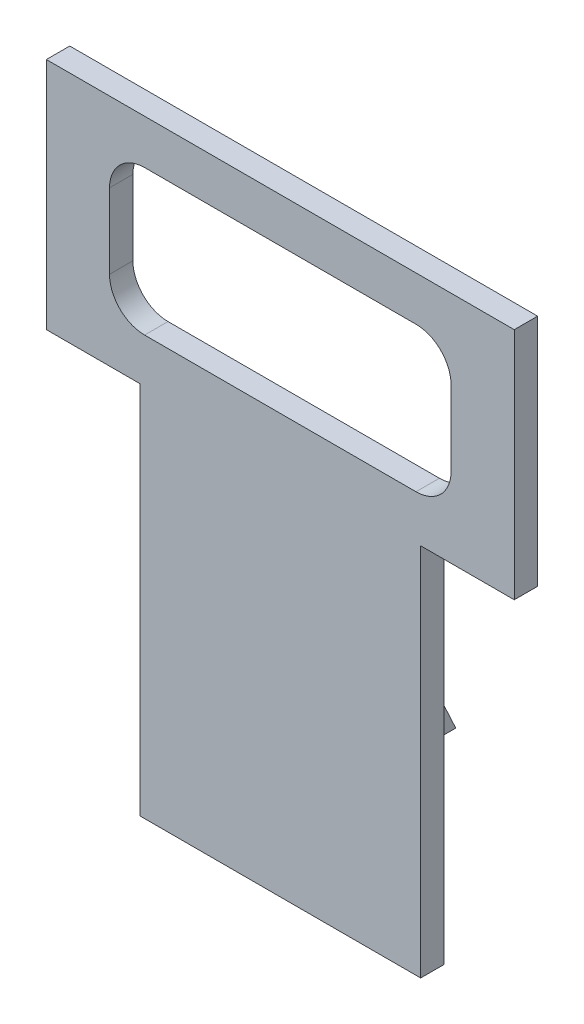
ISO-10303-21;
HEADER;
FILE_DESCRIPTION(('STEP AP214'),'2;1');
FILE_NAME('part.step','',(''),(''),'','','');
FILE_SCHEMA(('AUTOMOTIVE_DESIGN { 1 0 10303 214 1 1 1 1 }'));
ENDSEC;
DATA;
#1=APPLICATION_CONTEXT('core data for automotive mechanical design processes');
#2=APPLICATION_PROTOCOL_DEFINITION('international standard','automotive_design',2000,#1);
#3=PRODUCT_CONTEXT('',#1,'mechanical');
#4=PRODUCT('Part','Part','',(#3));
#5=PRODUCT_RELATED_PRODUCT_CATEGORY('part','',(#4));
#6=PRODUCT_DEFINITION_FORMATION('','',#4);
#7=PRODUCT_DEFINITION_CONTEXT('part definition',#1,'design');
#8=PRODUCT_DEFINITION('design','',#6,#7);
#9=PRODUCT_DEFINITION_SHAPE('','',#8);
#10=(LENGTH_UNIT() NAMED_UNIT(*) SI_UNIT(.MILLI.,.METRE.));
#11=(NAMED_UNIT(*) PLANE_ANGLE_UNIT() SI_UNIT($,.RADIAN.));
#12=(NAMED_UNIT(*) SI_UNIT($,.STERADIAN.) SOLID_ANGLE_UNIT());
#13=UNCERTAINTY_MEASURE_WITH_UNIT(LENGTH_MEASURE(1.E-05),#10,'distance_accuracy_value','');
#14=(GEOMETRIC_REPRESENTATION_CONTEXT(3) GLOBAL_UNCERTAINTY_ASSIGNED_CONTEXT((#13)) GLOBAL_UNIT_ASSIGNED_CONTEXT((#10,
#11,#12)) REPRESENTATION_CONTEXT('',''));
#15=CARTESIAN_POINT('',(0.,0.,0.));
#16=DIRECTION('',(0.,0.,1.));
#17=DIRECTION('',(1.,0.,0.));
#18=AXIS2_PLACEMENT_3D('',#15,#16,#17);
#19=CARTESIAN_POINT('',(0.,0.,0.));
#20=DIRECTION('',(0.,0.,-1.));
#21=DIRECTION('',(-1.,0.,0.));
#22=AXIS2_PLACEMENT_3D('',#19,#20,#21);
#23=PLANE('',#22);
#24=CARTESIAN_POINT('',(21.,17.,0.));
#25=DIRECTION('',(0.,0.,1.));
#26=DIRECTION('',(1.,0.,0.));
#27=AXIS2_PLACEMENT_3D('',#24,#25,#26);
#28=CIRCLE('',#27,7.5);
#29=CARTESIAN_POINT('',(13.5,17.,0.));
#30=VERTEX_POINT('',#29);
#31=CARTESIAN_POINT('',(21.,9.50000000000001,0.));
#32=VERTEX_POINT('',#31);
#33=EDGE_CURVE('E241',#30,#32,#28,.T.);
#34=ORIENTED_EDGE('',*,*,#33,.T.);
#35=DIRECTION('',(1.,0.,0.));
#36=VECTOR('',#35,1.);
#37=CARTESIAN_POINT('',(21.,9.50000000000001,0.));
#38=LINE('',#37,#36);
#39=CARTESIAN_POINT('',(79.,9.50000000000001,0.));
#40=VERTEX_POINT('',#39);
#41=EDGE_CURVE('E245',#32,#40,#38,.T.);
#42=ORIENTED_EDGE('',*,*,#41,.T.);
#43=CARTESIAN_POINT('',(79.,17.,0.));
#44=DIRECTION('',(0.,0.,1.));
#45=DIRECTION('',(1.,0.,0.));
#46=AXIS2_PLACEMENT_3D('',#43,#44,#45);
#47=CIRCLE('',#46,7.5);
#48=CARTESIAN_POINT('',(86.5,17.,0.));
#49=VERTEX_POINT('',#48);
#50=EDGE_CURVE('E250',#40,#49,#47,.T.);
#51=ORIENTED_EDGE('',*,*,#50,.T.);
#52=DIRECTION('',(0.,1.,0.));
#53=VECTOR('',#52,1.);
#54=CARTESIAN_POINT('',(86.5,33.,0.));
#55=LINE('',#54,#53);
#56=CARTESIAN_POINT('',(86.5,33.,0.));
#57=VERTEX_POINT('',#56);
#58=EDGE_CURVE('E254',#49,#57,#55,.T.);
#59=ORIENTED_EDGE('',*,*,#58,.T.);
#60=CARTESIAN_POINT('',(79.,33.,0.));
#61=DIRECTION('',(0.,0.,1.));
#62=DIRECTION('',(1.,0.,0.));
#63=AXIS2_PLACEMENT_3D('',#60,#61,#62);
#64=CIRCLE('',#63,7.50000000000001);
#65=CARTESIAN_POINT('',(79.,40.5,0.));
#66=VERTEX_POINT('',#65);
#67=EDGE_CURVE('E258',#57,#66,#64,.T.);
#68=ORIENTED_EDGE('',*,*,#67,.T.);
#69=DIRECTION('',(-1.,0.,0.));
#70=VECTOR('',#69,1.);
#71=CARTESIAN_POINT('',(21.,40.5,0.));
#72=LINE('',#71,#70);
#73=CARTESIAN_POINT('',(21.,40.5,0.));
#74=VERTEX_POINT('',#73);
#75=EDGE_CURVE('E262',#66,#74,#72,.T.);
#76=ORIENTED_EDGE('',*,*,#75,.T.);
#77=CARTESIAN_POINT('',(21.,33.,0.));
#78=DIRECTION('',(0.,0.,1.));
#79=DIRECTION('',(1.,0.,0.));
#80=AXIS2_PLACEMENT_3D('',#77,#78,#79);
#81=CIRCLE('',#80,7.5);
#82=CARTESIAN_POINT('',(13.5,33.,0.));
#83=VERTEX_POINT('',#82);
#84=EDGE_CURVE('E266',#74,#83,#81,.T.);
#85=ORIENTED_EDGE('',*,*,#84,.T.);
#86=DIRECTION('',(0.,-1.,0.));
#87=VECTOR('',#86,1.);
#88=CARTESIAN_POINT('',(13.5,33.,0.));
#89=LINE('',#88,#87);
#90=EDGE_CURVE('E270',#83,#30,#89,.T.);
#91=ORIENTED_EDGE('',*,*,#90,.T.);
#92=EDGE_LOOP('',(#34,#42,#51,#59,#68,#76,#85,#91));
#93=FACE_BOUND('',#92,.T.);
#94=DIRECTION('',(0.,-1.,0.));
#95=VECTOR('',#94,1.);
#96=CARTESIAN_POINT('',(0.,0.,0.));
#97=LINE('',#96,#95);
#98=CARTESIAN_POINT('',(0.,50.,0.));
#99=VERTEX_POINT('',#98);
#100=CARTESIAN_POINT('',(0.,0.,0.));
#101=VERTEX_POINT('',#100);
#102=EDGE_CURVE('E307',#99,#101,#97,.T.);
#103=ORIENTED_EDGE('',*,*,#102,.F.);
#104=DIRECTION('',(-1.,0.,0.));
#105=VECTOR('',#104,1.);
#106=CARTESIAN_POINT('',(0.,50.,0.));
#107=LINE('',#106,#105);
#108=CARTESIAN_POINT('',(100.,50.,0.));
#109=VERTEX_POINT('',#108);
#110=EDGE_CURVE('E334',#109,#99,#107,.T.);
#111=ORIENTED_EDGE('',*,*,#110,.F.);
#112=DIRECTION('',(0.,1.,0.));
#113=VECTOR('',#112,1.);
#114=CARTESIAN_POINT('',(100.,0.,0.));
#115=LINE('',#114,#113);
#116=CARTESIAN_POINT('',(100.,0.,0.));
#117=VERTEX_POINT('',#116);
#118=EDGE_CURVE('E352',#117,#109,#115,.T.);
#119=ORIENTED_EDGE('',*,*,#118,.F.);
#120=DIRECTION('',(1.,0.,0.));
#121=VECTOR('',#120,1.);
#122=CARTESIAN_POINT('',(0.,0.,0.));
#123=LINE('',#122,#121);
#124=CARTESIAN_POINT('',(80.,0.,0.));
#125=VERTEX_POINT('',#124);
#126=EDGE_CURVE('E348',#125,#117,#123,.T.);
#127=ORIENTED_EDGE('',*,*,#126,.F.);
#128=DIRECTION('',(0.,1.,0.));
#129=VECTOR('',#128,1.);
#130=CARTESIAN_POINT('',(80.,-80.,0.));
#131=LINE('',#130,#129);
#132=CARTESIAN_POINT('',(80.,-80.,0.));
#133=VERTEX_POINT('',#132);
#134=EDGE_CURVE('E232',#133,#125,#131,.T.);
#135=ORIENTED_EDGE('',*,*,#134,.F.);
#136=DIRECTION('',(1.,0.,0.));
#137=VECTOR('',#136,1.);
#138=CARTESIAN_POINT('',(20.,-80.,0.));
#139=LINE('',#138,#137);
#140=CARTESIAN_POINT('',(20.,-80.,0.));
#141=VERTEX_POINT('',#140);
#142=EDGE_CURVE('E211',#141,#133,#139,.T.);
#143=ORIENTED_EDGE('',*,*,#142,.F.);
#144=DIRECTION('',(0.,1.,0.));
#145=VECTOR('',#144,1.);
#146=CARTESIAN_POINT('',(20.,-80.,0.));
#147=LINE('',#146,#145);
#148=CARTESIAN_POINT('',(20.,0.,0.));
#149=VERTEX_POINT('',#148);
#150=EDGE_CURVE('E236',#141,#149,#147,.T.);
#151=ORIENTED_EDGE('',*,*,#150,.T.);
#152=EDGE_CURVE('E349',#101,#149,#123,.T.);
#153=ORIENTED_EDGE('',*,*,#152,.F.);
#154=EDGE_LOOP('',(#103,#111,#119,#127,#135,#143,#151,#153));
#155=FACE_BOUND('',#154,.T.);
#156=DIRECTION('',(-1.,0.,0.));
#157=VECTOR('',#156,1.);
#158=CARTESIAN_POINT('',(52.5,-65.,0.));
#159=LINE('',#158,#157);
#160=CARTESIAN_POINT('',(52.5,-65.,0.));
#161=VERTEX_POINT('',#160);
#162=CARTESIAN_POINT('',(47.5,-65.,0.));
#163=VERTEX_POINT('',#162);
#164=EDGE_CURVE('E192',#161,#163,#159,.T.);
#165=ORIENTED_EDGE('',*,*,#164,.F.);
#166=DIRECTION('',(0.,-1.,0.));
#167=VECTOR('',#166,1.);
#168=CARTESIAN_POINT('',(52.5,0.,0.));
#169=LINE('',#168,#167);
#170=CARTESIAN_POINT('',(52.5,0.,0.));
#171=VERTEX_POINT('',#170);
#172=EDGE_CURVE('E182',#171,#161,#169,.T.);
#173=ORIENTED_EDGE('',*,*,#172,.F.);
#174=DIRECTION('',(1.,0.,0.));
#175=VECTOR('',#174,1.);
#176=CARTESIAN_POINT('',(52.5,0.,0.));
#177=LINE('',#176,#175);
#178=CARTESIAN_POINT('',(47.5,0.,0.));
#179=VERTEX_POINT('',#178);
#180=EDGE_CURVE('E174',#179,#171,#177,.T.);
#181=ORIENTED_EDGE('',*,*,#180,.F.);
#182=DIRECTION('',(0.,1.,0.));
#183=VECTOR('',#182,1.);
#184=CARTESIAN_POINT('',(47.5,0.,0.));
#185=LINE('',#184,#183);
#186=EDGE_CURVE('E186',#163,#179,#185,.T.);
#187=ORIENTED_EDGE('',*,*,#186,.F.);
#188=EDGE_LOOP('',(#165,#173,#181,#187));
#189=FACE_BOUND('',#188,.T.);
#190=ADVANCED_FACE('F39',(#93,#155,#189),#23,.T.);
#191=CARTESIAN_POINT('',(0.,0.,5.));
#192=DIRECTION('',(0.,1.,0.));
#193=DIRECTION('',(0.,0.,1.));
#194=AXIS2_PLACEMENT_3D('',#191,#192,#193);
#195=PLANE('',#194);
#196=DIRECTION('',(0.,0.,-1.));
#197=VECTOR('',#196,1.);
#198=CARTESIAN_POINT('',(20.,0.,5.));
#199=LINE('',#198,#197);
#200=CARTESIAN_POINT('',(20.,0.,5.));
#201=VERTEX_POINT('',#200);
#202=EDGE_CURVE('E55',#201,#149,#199,.T.);
#203=ORIENTED_EDGE('',*,*,#202,.F.);
#204=DIRECTION('',(1.,0.,0.));
#205=VECTOR('',#204,1.);
#206=CARTESIAN_POINT('',(0.,0.,5.));
#207=LINE('',#206,#205);
#208=CARTESIAN_POINT('',(0.,0.,5.));
#209=VERTEX_POINT('',#208);
#210=EDGE_CURVE('E335',#209,#201,#207,.T.);
#211=ORIENTED_EDGE('',*,*,#210,.F.);
#212=DIRECTION('',(0.,0.,-1.));
#213=VECTOR('',#212,1.);
#214=CARTESIAN_POINT('',(0.,0.,5.));
#215=LINE('',#214,#213);
#216=EDGE_CURVE('E11',#209,#101,#215,.T.);
#217=ORIENTED_EDGE('',*,*,#216,.T.);
#218=ORIENTED_EDGE('',*,*,#152,.T.);
#219=EDGE_LOOP('',(#203,#211,#217,#218));
#220=FACE_BOUND('',#219,.T.);
#221=ADVANCED_FACE('F391',(#220),#195,.F.);
#222=DIRECTION('',(0.,0.,1.));
#223=VECTOR('',#222,1.);
#224=CARTESIAN_POINT('',(80.,0.,5.));
#225=LINE('',#224,#223);
#226=CARTESIAN_POINT('',(80.,0.,5.));
#227=VERTEX_POINT('',#226);
#228=EDGE_CURVE('E63',#125,#227,#225,.T.);
#229=ORIENTED_EDGE('',*,*,#228,.F.);
#230=ORIENTED_EDGE('',*,*,#126,.T.);
#231=DIRECTION('',(0.,0.,-1.));
#232=VECTOR('',#231,1.);
#233=CARTESIAN_POINT('',(100.,0.,5.));
#234=LINE('',#233,#232);
#235=CARTESIAN_POINT('',(100.,0.,5.));
#236=VERTEX_POINT('',#235);
#237=EDGE_CURVE('E48',#236,#117,#234,.T.);
#238=ORIENTED_EDGE('',*,*,#237,.F.);
#239=EDGE_CURVE('E333',#227,#236,#207,.T.);
#240=ORIENTED_EDGE('',*,*,#239,.F.);
#241=EDGE_LOOP('',(#229,#230,#238,#240));
#242=FACE_BOUND('',#241,.T.);
#243=ADVANCED_FACE('F389',(#242),#195,.F.);
#244=CARTESIAN_POINT('',(0.,0.,5.));
#245=DIRECTION('',(1.,0.,0.));
#246=DIRECTION('',(0.,0.,-1.));
#247=AXIS2_PLACEMENT_3D('',#244,#245,#246);
#248=PLANE('',#247);
#249=ORIENTED_EDGE('',*,*,#102,.T.);
#250=ORIENTED_EDGE('',*,*,#216,.F.);
#251=DIRECTION('',(0.,-1.,0.));
#252=VECTOR('',#251,1.);
#253=CARTESIAN_POINT('',(0.,0.,5.));
#254=LINE('',#253,#252);
#255=CARTESIAN_POINT('',(0.,50.,5.));
#256=VERTEX_POINT('',#255);
#257=EDGE_CURVE('E329',#256,#209,#254,.T.);
#258=ORIENTED_EDGE('',*,*,#257,.F.);
#259=DIRECTION('',(0.,0.,-1.));
#260=VECTOR('',#259,1.);
#261=CARTESIAN_POINT('',(0.,50.,5.));
#262=LINE('',#261,#260);
#263=EDGE_CURVE('E344',#256,#99,#262,.T.);
#264=ORIENTED_EDGE('',*,*,#263,.T.);
#265=EDGE_LOOP('',(#249,#250,#258,#264));
#266=FACE_BOUND('',#265,.T.);
#267=ADVANCED_FACE('F41',(#266),#248,.F.);
#268=CARTESIAN_POINT('',(100.,0.,5.));
#269=DIRECTION('',(-1.,0.,0.));
#270=DIRECTION('',(0.,0.,1.));
#271=AXIS2_PLACEMENT_3D('',#268,#269,#270);
#272=PLANE('',#271);
#273=ORIENTED_EDGE('',*,*,#118,.T.);
#274=DIRECTION('',(0.,0.,-1.));
#275=VECTOR('',#274,1.);
#276=CARTESIAN_POINT('',(100.,50.,5.));
#277=LINE('',#276,#275);
#278=CARTESIAN_POINT('',(100.,50.,5.));
#279=VERTEX_POINT('',#278);
#280=EDGE_CURVE('E360',#279,#109,#277,.T.);
#281=ORIENTED_EDGE('',*,*,#280,.F.);
#282=DIRECTION('',(0.,1.,0.));
#283=VECTOR('',#282,1.);
#284=CARTESIAN_POINT('',(100.,0.,5.));
#285=LINE('',#284,#283);
#286=EDGE_CURVE('E338',#236,#279,#285,.T.);
#287=ORIENTED_EDGE('',*,*,#286,.F.);
#288=ORIENTED_EDGE('',*,*,#237,.T.);
#289=EDGE_LOOP('',(#273,#281,#287,#288));
#290=FACE_BOUND('',#289,.T.);
#291=ADVANCED_FACE('F369',(#290),#272,.F.);
#292=CARTESIAN_POINT('',(0.,50.,5.));
#293=DIRECTION('',(0.,-1.,0.));
#294=DIRECTION('',(0.,0.,-1.));
#295=AXIS2_PLACEMENT_3D('',#292,#293,#294);
#296=PLANE('',#295);
#297=ORIENTED_EDGE('',*,*,#110,.T.);
#298=ORIENTED_EDGE('',*,*,#263,.F.);
#299=DIRECTION('',(-1.,0.,0.));
#300=VECTOR('',#299,1.);
#301=CARTESIAN_POINT('',(0.,50.,5.));
#302=LINE('',#301,#300);
#303=EDGE_CURVE('E341',#279,#256,#302,.T.);
#304=ORIENTED_EDGE('',*,*,#303,.F.);
#305=ORIENTED_EDGE('',*,*,#280,.T.);
#306=EDGE_LOOP('',(#297,#298,#304,#305));
#307=FACE_BOUND('',#306,.T.);
#308=ADVANCED_FACE('F377',(#307),#296,.F.);
#309=CARTESIAN_POINT('',(0.,0.,5.));
#310=DIRECTION('',(0.,0.,-1.));
#311=DIRECTION('',(-1.,0.,0.));
#312=AXIS2_PLACEMENT_3D('',#309,#310,#311);
#313=PLANE('',#312);
#314=DIRECTION('',(1.,0.,0.));
#315=VECTOR('',#314,1.);
#316=CARTESIAN_POINT('',(21.,9.50000000000001,5.));
#317=LINE('',#316,#315);
#318=CARTESIAN_POINT('',(21.,9.50000000000001,5.));
#319=VERTEX_POINT('',#318);
#320=CARTESIAN_POINT('',(79.,9.50000000000001,5.));
#321=VERTEX_POINT('',#320);
#322=EDGE_CURVE('E277',#319,#321,#317,.T.);
#323=ORIENTED_EDGE('',*,*,#322,.F.);
#324=CARTESIAN_POINT('',(21.,17.,5.));
#325=DIRECTION('',(0.,0.,1.));
#326=DIRECTION('',(1.,0.,0.));
#327=AXIS2_PLACEMENT_3D('',#324,#325,#326);
#328=CIRCLE('',#327,7.5);
#329=CARTESIAN_POINT('',(13.5,17.,5.));
#330=VERTEX_POINT('',#329);
#331=EDGE_CURVE('E240',#330,#319,#328,.T.);
#332=ORIENTED_EDGE('',*,*,#331,.F.);
#333=DIRECTION('',(0.,-1.,0.));
#334=VECTOR('',#333,1.);
#335=CARTESIAN_POINT('',(13.5,33.,5.));
#336=LINE('',#335,#334);
#337=CARTESIAN_POINT('',(13.5,33.,5.));
#338=VERTEX_POINT('',#337);
#339=EDGE_CURVE('E246',#338,#330,#336,.T.);
#340=ORIENTED_EDGE('',*,*,#339,.F.);
#341=CARTESIAN_POINT('',(21.,33.,5.));
#342=DIRECTION('',(0.,0.,1.));
#343=DIRECTION('',(1.,0.,0.));
#344=AXIS2_PLACEMENT_3D('',#341,#342,#343);
#345=CIRCLE('',#344,7.5);
#346=CARTESIAN_POINT('',(21.,40.5,5.));
#347=VERTEX_POINT('',#346);
#348=EDGE_CURVE('E297',#347,#338,#345,.T.);
#349=ORIENTED_EDGE('',*,*,#348,.F.);
#350=DIRECTION('',(-1.,0.,0.));
#351=VECTOR('',#350,1.);
#352=CARTESIAN_POINT('',(21.,40.5,5.));
#353=LINE('',#352,#351);
#354=CARTESIAN_POINT('',(79.,40.5,5.));
#355=VERTEX_POINT('',#354);
#356=EDGE_CURVE('E293',#355,#347,#353,.T.);
#357=ORIENTED_EDGE('',*,*,#356,.F.);
#358=CARTESIAN_POINT('',(79.,33.,5.));
#359=DIRECTION('',(0.,0.,1.));
#360=DIRECTION('',(1.,0.,0.));
#361=AXIS2_PLACEMENT_3D('',#358,#359,#360);
#362=CIRCLE('',#361,7.50000000000001);
#363=CARTESIAN_POINT('',(86.5,33.,5.));
#364=VERTEX_POINT('',#363);
#365=EDGE_CURVE('E289',#364,#355,#362,.T.);
#366=ORIENTED_EDGE('',*,*,#365,.F.);
#367=DIRECTION('',(0.,1.,0.));
#368=VECTOR('',#367,1.);
#369=CARTESIAN_POINT('',(86.5,33.,5.));
#370=LINE('',#369,#368);
#371=CARTESIAN_POINT('',(86.5,17.,5.));
#372=VERTEX_POINT('',#371);
#373=EDGE_CURVE('E285',#372,#364,#370,.T.);
#374=ORIENTED_EDGE('',*,*,#373,.F.);
#375=CARTESIAN_POINT('',(79.,17.,5.));
#376=DIRECTION('',(0.,0.,1.));
#377=DIRECTION('',(1.,0.,0.));
#378=AXIS2_PLACEMENT_3D('',#375,#376,#377);
#379=CIRCLE('',#378,7.5);
#380=EDGE_CURVE('E281',#321,#372,#379,.T.);
#381=ORIENTED_EDGE('',*,*,#380,.F.);
#382=EDGE_LOOP('',(#323,#332,#340,#349,#357,#366,#374,#381));
#383=FACE_BOUND('',#382,.T.);
#384=ORIENTED_EDGE('',*,*,#257,.T.);
#385=ORIENTED_EDGE('',*,*,#210,.T.);
#386=DIRECTION('',(0.,1.,0.));
#387=VECTOR('',#386,1.);
#388=CARTESIAN_POINT('',(20.,-80.,5.));
#389=LINE('',#388,#387);
#390=CARTESIAN_POINT('',(20.,-80.,5.));
#391=VERTEX_POINT('',#390);
#392=EDGE_CURVE('E220',#391,#201,#389,.T.);
#393=ORIENTED_EDGE('',*,*,#392,.F.);
#394=DIRECTION('',(-1.,0.,0.));
#395=VECTOR('',#394,1.);
#396=CARTESIAN_POINT('',(20.,-80.,5.));
#397=LINE('',#396,#395);
#398=CARTESIAN_POINT('',(80.,-80.,5.));
#399=VERTEX_POINT('',#398);
#400=EDGE_CURVE('E217',#399,#391,#397,.T.);
#401=ORIENTED_EDGE('',*,*,#400,.F.);
#402=DIRECTION('',(0.,1.,0.));
#403=VECTOR('',#402,1.);
#404=CARTESIAN_POINT('',(80.,-80.,5.));
#405=LINE('',#404,#403);
#406=EDGE_CURVE('E228',#399,#227,#405,.T.);
#407=ORIENTED_EDGE('',*,*,#406,.T.);
#408=ORIENTED_EDGE('',*,*,#239,.T.);
#409=ORIENTED_EDGE('',*,*,#286,.T.);
#410=ORIENTED_EDGE('',*,*,#303,.T.);
#411=EDGE_LOOP('',(#384,#385,#393,#401,#407,#408,#409,#410));
#412=FACE_BOUND('',#411,.T.);
#413=ADVANCED_FACE('F383',(#383,#412),#313,.F.);
#414=CARTESIAN_POINT('',(21.,17.,0.));
#415=DIRECTION('',(0.,0.,1.));
#416=DIRECTION('',(1.,0.,0.));
#417=AXIS2_PLACEMENT_3D('',#414,#415,#416);
#418=CYLINDRICAL_SURFACE('',#417,7.5);
#419=ORIENTED_EDGE('',*,*,#331,.T.);
#420=DIRECTION('',(0.,0.,1.));
#421=VECTOR('',#420,1.);
#422=CARTESIAN_POINT('',(21.,9.50000000000001,0.));
#423=LINE('',#422,#421);
#424=EDGE_CURVE('E274',#32,#319,#423,.T.);
#425=ORIENTED_EDGE('',*,*,#424,.F.);
#426=ORIENTED_EDGE('',*,*,#33,.F.);
#427=DIRECTION('',(0.,0.,1.));
#428=VECTOR('',#427,1.);
#429=CARTESIAN_POINT('',(13.5,17.,0.));
#430=LINE('',#429,#428);
#431=EDGE_CURVE('E304',#30,#330,#430,.T.);
#432=ORIENTED_EDGE('',*,*,#431,.T.);
#433=EDGE_LOOP('',(#419,#425,#426,#432));
#434=FACE_BOUND('',#433,.T.);
#435=ADVANCED_FACE('F422',(#434),#418,.F.);
#436=CARTESIAN_POINT('',(13.5,33.,0.));
#437=DIRECTION('',(-1.,0.,0.));
#438=DIRECTION('',(0.,-1.,0.));
#439=AXIS2_PLACEMENT_3D('',#436,#437,#438);
#440=PLANE('',#439);
#441=ORIENTED_EDGE('',*,*,#339,.T.);
#442=ORIENTED_EDGE('',*,*,#431,.F.);
#443=ORIENTED_EDGE('',*,*,#90,.F.);
#444=DIRECTION('',(0.,0.,1.));
#445=VECTOR('',#444,1.);
#446=CARTESIAN_POINT('',(13.5,33.,0.));
#447=LINE('',#446,#445);
#448=EDGE_CURVE('E308',#83,#338,#447,.T.);
#449=ORIENTED_EDGE('',*,*,#448,.T.);
#450=EDGE_LOOP('',(#441,#442,#443,#449));
#451=FACE_BOUND('',#450,.T.);
#452=ADVANCED_FACE('F425',(#451),#440,.F.);
#453=CARTESIAN_POINT('',(21.,33.,0.));
#454=DIRECTION('',(0.,0.,1.));
#455=DIRECTION('',(1.,0.,0.));
#456=AXIS2_PLACEMENT_3D('',#453,#454,#455);
#457=CYLINDRICAL_SURFACE('',#456,7.5);
#458=ORIENTED_EDGE('',*,*,#348,.T.);
#459=ORIENTED_EDGE('',*,*,#448,.F.);
#460=ORIENTED_EDGE('',*,*,#84,.F.);
#461=DIRECTION('',(0.,0.,1.));
#462=VECTOR('',#461,1.);
#463=CARTESIAN_POINT('',(21.,40.5,0.));
#464=LINE('',#463,#462);
#465=EDGE_CURVE('E311',#74,#347,#464,.T.);
#466=ORIENTED_EDGE('',*,*,#465,.T.);
#467=EDGE_LOOP('',(#458,#459,#460,#466));
#468=FACE_BOUND('',#467,.T.);
#469=ADVANCED_FACE('F432',(#468),#457,.F.);
#470=CARTESIAN_POINT('',(21.,40.5,0.));
#471=DIRECTION('',(0.,1.,0.));
#472=DIRECTION('',(-1.,0.,0.));
#473=AXIS2_PLACEMENT_3D('',#470,#471,#472);
#474=PLANE('',#473);
#475=ORIENTED_EDGE('',*,*,#356,.T.);
#476=ORIENTED_EDGE('',*,*,#465,.F.);
#477=ORIENTED_EDGE('',*,*,#75,.F.);
#478=DIRECTION('',(0.,0.,1.));
#479=VECTOR('',#478,1.);
#480=CARTESIAN_POINT('',(79.,40.5,0.));
#481=LINE('',#480,#479);
#482=EDGE_CURVE('E314',#66,#355,#481,.T.);
#483=ORIENTED_EDGE('',*,*,#482,.T.);
#484=EDGE_LOOP('',(#475,#476,#477,#483));
#485=FACE_BOUND('',#484,.T.);
#486=ADVANCED_FACE('F440',(#485),#474,.F.);
#487=CARTESIAN_POINT('',(79.,33.,0.));
#488=DIRECTION('',(0.,0.,1.));
#489=DIRECTION('',(1.,0.,0.));
#490=AXIS2_PLACEMENT_3D('',#487,#488,#489);
#491=CYLINDRICAL_SURFACE('',#490,7.50000000000001);
#492=ORIENTED_EDGE('',*,*,#365,.T.);
#493=ORIENTED_EDGE('',*,*,#482,.F.);
#494=ORIENTED_EDGE('',*,*,#67,.F.);
#495=DIRECTION('',(0.,0.,1.));
#496=VECTOR('',#495,1.);
#497=CARTESIAN_POINT('',(86.5,33.,0.));
#498=LINE('',#497,#496);
#499=EDGE_CURVE('E317',#57,#364,#498,.T.);
#500=ORIENTED_EDGE('',*,*,#499,.T.);
#501=EDGE_LOOP('',(#492,#493,#494,#500));
#502=FACE_BOUND('',#501,.T.);
#503=ADVANCED_FACE('F448',(#502),#491,.F.);
#504=CARTESIAN_POINT('',(86.5,33.,0.));
#505=DIRECTION('',(1.,0.,0.));
#506=DIRECTION('',(0.,0.,-1.));
#507=AXIS2_PLACEMENT_3D('',#504,#505,#506);
#508=PLANE('',#507);
#509=ORIENTED_EDGE('',*,*,#373,.T.);
#510=ORIENTED_EDGE('',*,*,#499,.F.);
#511=ORIENTED_EDGE('',*,*,#58,.F.);
#512=DIRECTION('',(0.,0.,1.));
#513=VECTOR('',#512,1.);
#514=CARTESIAN_POINT('',(86.5,17.,0.));
#515=LINE('',#514,#513);
#516=EDGE_CURVE('E320',#49,#372,#515,.T.);
#517=ORIENTED_EDGE('',*,*,#516,.T.);
#518=EDGE_LOOP('',(#509,#510,#511,#517));
#519=FACE_BOUND('',#518,.T.);
#520=ADVANCED_FACE('F456',(#519),#508,.F.);
#521=CARTESIAN_POINT('',(79.,17.,0.));
#522=DIRECTION('',(0.,0.,1.));
#523=DIRECTION('',(1.,0.,0.));
#524=AXIS2_PLACEMENT_3D('',#521,#522,#523);
#525=CYLINDRICAL_SURFACE('',#524,7.5);
#526=ORIENTED_EDGE('',*,*,#380,.T.);
#527=ORIENTED_EDGE('',*,*,#516,.F.);
#528=ORIENTED_EDGE('',*,*,#50,.F.);
#529=DIRECTION('',(0.,0.,1.));
#530=VECTOR('',#529,1.);
#531=CARTESIAN_POINT('',(79.,9.50000000000001,0.));
#532=LINE('',#531,#530);
#533=EDGE_CURVE('E323',#40,#321,#532,.T.);
#534=ORIENTED_EDGE('',*,*,#533,.T.);
#535=EDGE_LOOP('',(#526,#527,#528,#534));
#536=FACE_BOUND('',#535,.T.);
#537=ADVANCED_FACE('F464',(#536),#525,.F.);
#538=CARTESIAN_POINT('',(21.,9.50000000000001,0.));
#539=DIRECTION('',(0.,-1.,0.));
#540=DIRECTION('',(0.,0.,-1.));
#541=AXIS2_PLACEMENT_3D('',#538,#539,#540);
#542=PLANE('',#541);
#543=ORIENTED_EDGE('',*,*,#322,.T.);
#544=ORIENTED_EDGE('',*,*,#533,.F.);
#545=ORIENTED_EDGE('',*,*,#41,.F.);
#546=ORIENTED_EDGE('',*,*,#424,.T.);
#547=EDGE_LOOP('',(#543,#544,#545,#546));
#548=FACE_BOUND('',#547,.T.);
#549=ADVANCED_FACE('F472',(#548),#542,.F.);
#550=CARTESIAN_POINT('',(20.,-80.,5.));
#551=DIRECTION('',(1.,0.,0.));
#552=DIRECTION('',(0.,0.,-1.));
#553=AXIS2_PLACEMENT_3D('',#550,#551,#552);
#554=PLANE('',#553);
#555=ORIENTED_EDGE('',*,*,#202,.T.);
#556=ORIENTED_EDGE('',*,*,#150,.F.);
#557=DIRECTION('',(0.,0.,-1.));
#558=VECTOR('',#557,1.);
#559=CARTESIAN_POINT('',(20.,-80.,5.));
#560=LINE('',#559,#558);
#561=EDGE_CURVE('E207',#391,#141,#560,.T.);
#562=ORIENTED_EDGE('',*,*,#561,.F.);
#563=ORIENTED_EDGE('',*,*,#392,.T.);
#564=EDGE_LOOP('',(#555,#556,#562,#563));
#565=FACE_BOUND('',#564,.T.);
#566=ADVANCED_FACE('F480',(#565),#554,.F.);
#567=CARTESIAN_POINT('',(80.,-80.,5.));
#568=DIRECTION('',(-1.,0.,0.));
#569=DIRECTION('',(0.,0.,1.));
#570=AXIS2_PLACEMENT_3D('',#567,#568,#569);
#571=PLANE('',#570);
#572=ORIENTED_EDGE('',*,*,#228,.T.);
#573=ORIENTED_EDGE('',*,*,#406,.F.);
#574=DIRECTION('',(0.,0.,1.));
#575=VECTOR('',#574,1.);
#576=CARTESIAN_POINT('',(80.,-80.,5.));
#577=LINE('',#576,#575);
#578=EDGE_CURVE('E214',#133,#399,#577,.T.);
#579=ORIENTED_EDGE('',*,*,#578,.F.);
#580=ORIENTED_EDGE('',*,*,#134,.T.);
#581=EDGE_LOOP('',(#572,#573,#579,#580));
#582=FACE_BOUND('',#581,.T.);
#583=ADVANCED_FACE('F502',(#582),#571,.F.);
#584=CARTESIAN_POINT('',(0.,-80.,0.));
#585=DIRECTION('',(0.,-1.,0.));
#586=DIRECTION('',(0.,0.,-1.));
#587=AXIS2_PLACEMENT_3D('',#584,#585,#586);
#588=PLANE('',#587);
#589=ORIENTED_EDGE('',*,*,#561,.T.);
#590=ORIENTED_EDGE('',*,*,#142,.T.);
#591=ORIENTED_EDGE('',*,*,#578,.T.);
#592=ORIENTED_EDGE('',*,*,#400,.T.);
#593=EDGE_LOOP('',(#589,#590,#591,#592));
#594=FACE_BOUND('',#593,.T.);
#595=ADVANCED_FACE('F510',(#594),#588,.T.);
#596=CARTESIAN_POINT('',(52.5,0.,-30.));
#597=DIRECTION('',(-1.,0.,0.));
#598=DIRECTION('',(0.,-1.,0.));
#599=AXIS2_PLACEMENT_3D('',#596,#597,#598);
#600=PLANE('',#599);
#601=DIRECTION('',(0.,0.,1.));
#602=VECTOR('',#601,1.);
#603=CARTESIAN_POINT('',(52.5,-65.,-30.));
#604=LINE('',#603,#602);
#605=CARTESIAN_POINT('',(52.5,-65.,-30.));
#606=VERTEX_POINT('',#605);
#607=EDGE_CURVE('E204',#606,#161,#604,.T.);
#608=ORIENTED_EDGE('',*,*,#607,.F.);
#609=DIRECTION('',(0.,-0.907959384500452,-0.419058177461747));
#610=VECTOR('',#609,1.);
#611=CARTESIAN_POINT('',(52.5,0.,0.));
#612=LINE('',#611,#610);
#613=EDGE_CURVE('E183',#171,#606,#612,.T.);
#614=ORIENTED_EDGE('',*,*,#613,.F.);
#615=ORIENTED_EDGE('',*,*,#172,.T.);
#616=EDGE_LOOP('',(#608,#614,#615));
#617=FACE_BOUND('',#616,.T.);
#618=ADVANCED_FACE('F517',(#617),#600,.F.);
#619=CARTESIAN_POINT('',(52.5,-65.,-30.));
#620=DIRECTION('',(0.,1.,0.));
#621=DIRECTION('',(0.,0.,1.));
#622=AXIS2_PLACEMENT_3D('',#619,#620,#621);
#623=PLANE('',#622);
#624=ORIENTED_EDGE('',*,*,#164,.T.);
#625=DIRECTION('',(0.,0.,1.));
#626=VECTOR('',#625,1.);
#627=CARTESIAN_POINT('',(47.5,-65.,-30.));
#628=LINE('',#627,#626);
#629=CARTESIAN_POINT('',(47.5,-65.,-30.));
#630=VERTEX_POINT('',#629);
#631=EDGE_CURVE('E188',#630,#163,#628,.T.);
#632=ORIENTED_EDGE('',*,*,#631,.F.);
#633=DIRECTION('',(-1.,0.,0.));
#634=VECTOR('',#633,1.);
#635=CARTESIAN_POINT('',(52.5,-65.,-30.));
#636=LINE('',#635,#634);
#637=EDGE_CURVE('E177',#606,#630,#636,.T.);
#638=ORIENTED_EDGE('',*,*,#637,.F.);
#639=ORIENTED_EDGE('',*,*,#607,.T.);
#640=EDGE_LOOP('',(#624,#632,#638,#639));
#641=FACE_BOUND('',#640,.T.);
#642=ADVANCED_FACE('F529',(#641),#623,.F.);
#643=CARTESIAN_POINT('',(47.5,0.,-30.));
#644=DIRECTION('',(1.,0.,0.));
#645=DIRECTION('',(0.,1.,0.));
#646=AXIS2_PLACEMENT_3D('',#643,#644,#645);
#647=PLANE('',#646);
#648=ORIENTED_EDGE('',*,*,#186,.T.);
#649=DIRECTION('',(0.,-0.907959384500452,-0.419058177461747));
#650=VECTOR('',#649,1.);
#651=CARTESIAN_POINT('',(47.5,0.,0.));
#652=LINE('',#651,#650);
#653=EDGE_CURVE('E170',#179,#630,#652,.T.);
#654=ORIENTED_EDGE('',*,*,#653,.T.);
#655=ORIENTED_EDGE('',*,*,#631,.T.);
#656=EDGE_LOOP('',(#648,#654,#655));
#657=FACE_BOUND('',#656,.T.);
#658=ADVANCED_FACE('F187',(#657),#647,.F.);
#659=CARTESIAN_POINT('',(47.5,0.,0.));
#660=DIRECTION('',(0.,-0.419058177461747,0.907959384500452));
#661=DIRECTION('',(0.,-0.907959384500452,-0.419058177461747));
#662=AXIS2_PLACEMENT_3D('',#659,#660,#661);
#663=PLANE('',#662);
#664=ORIENTED_EDGE('',*,*,#613,.T.);
#665=ORIENTED_EDGE('',*,*,#637,.T.);
#666=ORIENTED_EDGE('',*,*,#653,.F.);
#667=ORIENTED_EDGE('',*,*,#180,.T.);
#668=EDGE_LOOP('',(#664,#665,#666,#667));
#669=FACE_BOUND('',#668,.T.);
#670=ADVANCED_FACE('F172',(#669),#663,.F.);
#671=CLOSED_SHELL('',(#190,#221,#243,#267,#291,#308,#413,#435,#452,#469,#486,#503,#520,#537,
#549,#566,#583,#595,#618,#642,#658,#670));
#672=MANIFOLD_SOLID_BREP('B2',#671);
#673=ADVANCED_BREP_SHAPE_REPRESENTATION('',(#18,#672),#14);
#674=SHAPE_DEFINITION_REPRESENTATION(#9,#673);
ENDSEC;
END-ISO-10303-21;
